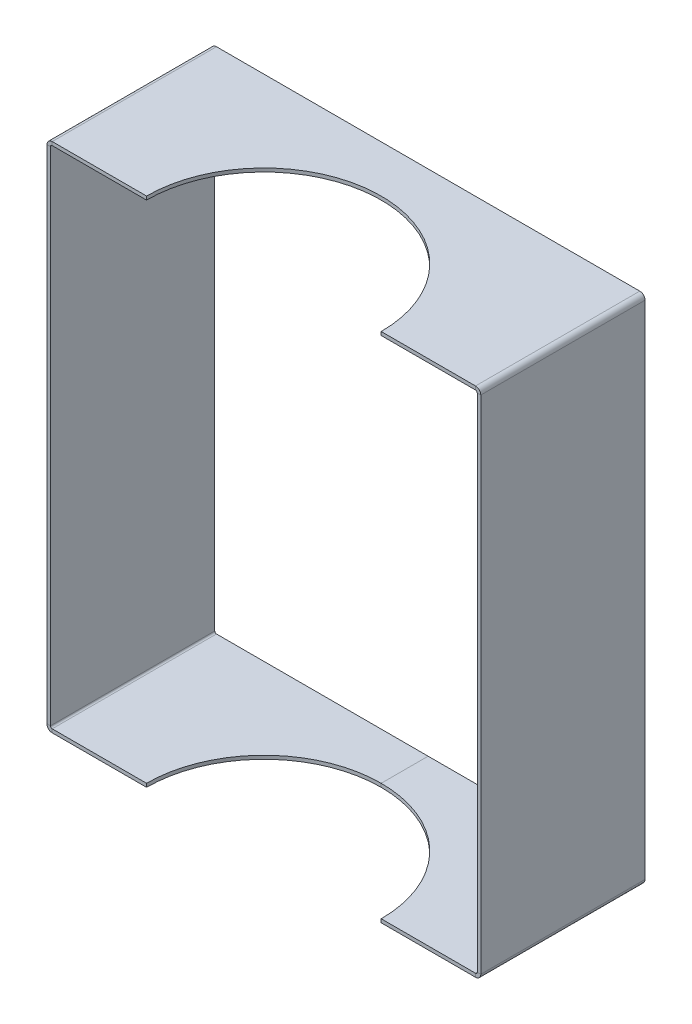
ISO-10303-21;
HEADER;
FILE_DESCRIPTION(('STEP AP214'),'2;1');
FILE_NAME('part.step','',(''),(''),'','','');
FILE_SCHEMA(('AUTOMOTIVE_DESIGN { 1 0 10303 214 1 1 1 1 }'));
ENDSEC;
DATA;
#1=APPLICATION_CONTEXT('core data for automotive mechanical design processes');
#2=APPLICATION_PROTOCOL_DEFINITION('international standard','automotive_design',2000,#1);
#3=PRODUCT_CONTEXT('',#1,'mechanical');
#4=PRODUCT('Part','Part','',(#3));
#5=PRODUCT_RELATED_PRODUCT_CATEGORY('part','',(#4));
#6=PRODUCT_DEFINITION_FORMATION('','',#4);
#7=PRODUCT_DEFINITION_CONTEXT('part definition',#1,'design');
#8=PRODUCT_DEFINITION('design','',#6,#7);
#9=PRODUCT_DEFINITION_SHAPE('','',#8);
#10=(LENGTH_UNIT() NAMED_UNIT(*) SI_UNIT(.MILLI.,.METRE.));
#11=(NAMED_UNIT(*) PLANE_ANGLE_UNIT() SI_UNIT($,.RADIAN.));
#12=(NAMED_UNIT(*) SI_UNIT($,.STERADIAN.) SOLID_ANGLE_UNIT());
#13=UNCERTAINTY_MEASURE_WITH_UNIT(LENGTH_MEASURE(1.E-05),#10,'distance_accuracy_value','');
#14=(GEOMETRIC_REPRESENTATION_CONTEXT(3) GLOBAL_UNCERTAINTY_ASSIGNED_CONTEXT((#13)) GLOBAL_UNIT_ASSIGNED_CONTEXT((#10,
#11,#12)) REPRESENTATION_CONTEXT('',''));
#15=CARTESIAN_POINT('',(0.,0.,0.));
#16=DIRECTION('',(0.,0.,1.));
#17=DIRECTION('',(1.,0.,0.));
#18=AXIS2_PLACEMENT_3D('',#15,#16,#17);
#19=CARTESIAN_POINT('',(-90.2234000000008,1.5,173.673110700389));
#20=DIRECTION('',(0.,0.,-1.));
#21=DIRECTION('',(-1.,0.,0.));
#22=AXIS2_PLACEMENT_3D('',#19,#20,#21);
#23=PLANE('',#22);
#24=DIRECTION('',(1.,0.,0.));
#25=VECTOR('',#24,1.);
#26=CARTESIAN_POINT('',(-90.2234000000008,0.,173.673110700389));
#27=LINE('',#26,#25);
#28=CARTESIAN_POINT('',(-90.2234000000008,0.,173.673110700389));
#29=VERTEX_POINT('',#28);
#30=CARTESIAN_POINT('',(-50.0234000000008,0.,173.673110700389));
#31=VERTEX_POINT('',#30);
#32=EDGE_CURVE('E151',#29,#31,#27,.T.);
#33=ORIENTED_EDGE('',*,*,#32,.T.);
#34=DIRECTION('',(0.,-1.,0.));
#35=VECTOR('',#34,1.);
#36=CARTESIAN_POINT('',(-50.0234000000008,1.5,173.673110700389));
#37=LINE('',#36,#35);
#38=CARTESIAN_POINT('',(-50.0234000000008,1.5,173.673110700389));
#39=VERTEX_POINT('',#38);
#40=EDGE_CURVE('E131',#39,#31,#37,.T.);
#41=ORIENTED_EDGE('',*,*,#40,.F.);
#42=DIRECTION('',(1.,0.,0.));
#43=VECTOR('',#42,1.);
#44=CARTESIAN_POINT('',(-90.2234000000008,1.5,173.673110700389));
#45=LINE('',#44,#43);
#46=CARTESIAN_POINT('',(-90.2234000000008,1.5,173.673110700389));
#47=VERTEX_POINT('',#46);
#48=EDGE_CURVE('E182',#47,#39,#45,.T.);
#49=ORIENTED_EDGE('',*,*,#48,.F.);
#50=DIRECTION('',(0.,-1.,0.));
#51=VECTOR('',#50,1.);
#52=CARTESIAN_POINT('',(-90.2234000000008,1.5,173.673110700389));
#53=LINE('',#52,#51);
#54=EDGE_CURVE('E13',#47,#29,#53,.T.);
#55=ORIENTED_EDGE('',*,*,#54,.T.);
#56=EDGE_LOOP('',(#33,#41,#49,#55));
#57=FACE_BOUND('',#56,.T.);
#58=ADVANCED_FACE('F123',(#57),#23,.F.);
#59=CARTESIAN_POINT('',(-0.0234000000007839,1.5,173.673110700389));
#60=DIRECTION('',(0.,-1.,0.));
#61=DIRECTION('',(0.,0.,-1.));
#62=AXIS2_PLACEMENT_3D('',#59,#60,#61);
#63=CYLINDRICAL_SURFACE('',#62,50.);
#64=CARTESIAN_POINT('',(-0.0234000000007839,0.,173.673110700389));
#65=DIRECTION('',(0.,-1.,0.));
#66=DIRECTION('',(0.,0.,-1.));
#67=AXIS2_PLACEMENT_3D('',#64,#65,#66);
#68=CIRCLE('',#67,50.);
#69=CARTESIAN_POINT('',(49.9765999999992,0.,173.673110700389));
#70=VERTEX_POINT('',#69);
#71=EDGE_CURVE('E211',#31,#70,#68,.T.);
#72=ORIENTED_EDGE('',*,*,#71,.T.);
#73=DIRECTION('',(0.,-1.,0.));
#74=VECTOR('',#73,1.);
#75=CARTESIAN_POINT('',(49.9765999999992,1.5,173.673110700389));
#76=LINE('',#75,#74);
#77=CARTESIAN_POINT('',(49.9765999999992,1.5,173.673110700389));
#78=VERTEX_POINT('',#77);
#79=EDGE_CURVE('E194',#78,#70,#76,.T.);
#80=ORIENTED_EDGE('',*,*,#79,.F.);
#81=CARTESIAN_POINT('',(-0.0234000000007839,1.5,173.673110700389));
#82=DIRECTION('',(0.,-1.,0.));
#83=DIRECTION('',(0.,0.,-1.));
#84=AXIS2_PLACEMENT_3D('',#81,#82,#83);
#85=CIRCLE('',#84,50.);
#86=EDGE_CURVE('E186',#39,#78,#85,.T.);
#87=ORIENTED_EDGE('',*,*,#86,.F.);
#88=ORIENTED_EDGE('',*,*,#40,.T.);
#89=EDGE_LOOP('',(#72,#80,#87,#88));
#90=FACE_BOUND('',#89,.T.);
#91=ADVANCED_FACE('F195',(#90),#63,.F.);
#92=CARTESIAN_POINT('',(49.9765999999992,1.5,173.673110700389));
#93=DIRECTION('',(0.,0.,-1.));
#94=DIRECTION('',(-1.,0.,0.));
#95=AXIS2_PLACEMENT_3D('',#92,#93,#94);
#96=PLANE('',#95);
#97=DIRECTION('',(1.,0.,0.));
#98=VECTOR('',#97,1.);
#99=CARTESIAN_POINT('',(49.9765999999992,0.,173.673110700389));
#100=LINE('',#99,#98);
#101=CARTESIAN_POINT('',(90.1765999999992,0.,173.673110700389));
#102=VERTEX_POINT('',#101);
#103=EDGE_CURVE('E213',#70,#102,#100,.T.);
#104=ORIENTED_EDGE('',*,*,#103,.T.);
#105=DIRECTION('',(0.,-1.,0.));
#106=VECTOR('',#105,1.);
#107=CARTESIAN_POINT('',(90.1765999999992,1.5,173.673110700389));
#108=LINE('',#107,#106);
#109=CARTESIAN_POINT('',(90.1765999999993,1.5,173.673110700389));
#110=VERTEX_POINT('',#109);
#111=EDGE_CURVE('E226',#110,#102,#108,.T.);
#112=ORIENTED_EDGE('',*,*,#111,.F.);
#113=DIRECTION('',(1.,0.,0.));
#114=VECTOR('',#113,1.);
#115=CARTESIAN_POINT('',(49.9765999999992,1.5,173.673110700389));
#116=LINE('',#115,#114);
#117=EDGE_CURVE('E198',#78,#110,#116,.T.);
#118=ORIENTED_EDGE('',*,*,#117,.F.);
#119=ORIENTED_EDGE('',*,*,#79,.T.);
#120=EDGE_LOOP('',(#104,#112,#118,#119));
#121=FACE_BOUND('',#120,.T.);
#122=ADVANCED_FACE('F230',(#121),#96,.F.);
#123=CARTESIAN_POINT('',(-90.2234000000008,1.5,103.673110700389));
#124=DIRECTION('',(0.,0.,1.));
#125=DIRECTION('',(1.,0.,0.));
#126=AXIS2_PLACEMENT_3D('',#123,#124,#125);
#127=PLANE('',#126);
#128=DIRECTION('',(-1.,0.,0.));
#129=VECTOR('',#128,1.);
#130=CARTESIAN_POINT('',(-90.2234000000008,0.,103.673110700389));
#131=LINE('',#130,#129);
#132=CARTESIAN_POINT('',(90.1765999999992,0.,103.673110700389));
#133=VERTEX_POINT('',#132);
#134=CARTESIAN_POINT('',(-90.2234000000008,0.,103.673110700389));
#135=VERTEX_POINT('',#134);
#136=EDGE_CURVE('E218',#133,#135,#131,.T.);
#137=ORIENTED_EDGE('',*,*,#136,.T.);
#138=DIRECTION('',(0.,-1.,0.));
#139=VECTOR('',#138,1.);
#140=CARTESIAN_POINT('',(-90.2234000000008,1.5,103.673110700389));
#141=LINE('',#140,#139);
#142=CARTESIAN_POINT('',(-90.2234000000008,1.49999999999998,103.673110700389));
#143=VERTEX_POINT('',#142);
#144=EDGE_CURVE('E206',#143,#135,#141,.T.);
#145=ORIENTED_EDGE('',*,*,#144,.F.);
#146=DIRECTION('',(-1.,0.,0.));
#147=VECTOR('',#146,1.);
#148=CARTESIAN_POINT('',(-90.2234000000008,1.5,103.673110700389));
#149=LINE('',#148,#147);
#150=CARTESIAN_POINT('',(90.1765999999992,1.5,103.673110700389));
#151=VERTEX_POINT('',#150);
#152=EDGE_CURVE('E204',#151,#143,#149,.T.);
#153=ORIENTED_EDGE('',*,*,#152,.F.);
#154=DIRECTION('',(0.,-1.,0.));
#155=VECTOR('',#154,1.);
#156=CARTESIAN_POINT('',(90.1765999999992,1.5,103.673110700389));
#157=LINE('',#156,#155);
#158=EDGE_CURVE('E223',#151,#133,#157,.T.);
#159=ORIENTED_EDGE('',*,*,#158,.T.);
#160=EDGE_LOOP('',(#137,#145,#153,#159));
#161=FACE_BOUND('',#160,.T.);
#162=ADVANCED_FACE('F254',(#161),#127,.F.);
#163=CARTESIAN_POINT('',(-0.0234000000007839,1.5,173.673110700389));
#164=DIRECTION('',(0.,-1.,0.));
#165=DIRECTION('',(0.,0.,-1.));
#166=AXIS2_PLACEMENT_3D('',#163,#164,#165);
#167=PLANE('',#166);
#168=DIRECTION('',(0.,0.,1.));
#169=VECTOR('',#168,1.);
#170=CARTESIAN_POINT('',(-90.2234000000008,1.5,103.673110700389));
#171=LINE('',#170,#169);
#172=EDGE_CURVE('E190',#143,#47,#171,.T.);
#173=ORIENTED_EDGE('',*,*,#172,.T.);
#174=ORIENTED_EDGE('',*,*,#48,.T.);
#175=ORIENTED_EDGE('',*,*,#86,.T.);
#176=ORIENTED_EDGE('',*,*,#117,.T.);
#177=DIRECTION('',(0.,0.,-1.));
#178=VECTOR('',#177,1.);
#179=CARTESIAN_POINT('',(90.1765999999992,1.5,103.673110700389));
#180=LINE('',#179,#178);
#181=EDGE_CURVE('E159',#110,#151,#180,.T.);
#182=ORIENTED_EDGE('',*,*,#181,.T.);
#183=ORIENTED_EDGE('',*,*,#152,.T.);
#184=EDGE_LOOP('',(#173,#174,#175,#176,#182,#183));
#185=FACE_BOUND('',#184,.T.);
#186=ADVANCED_FACE('F183',(#185),#167,.F.);
#187=CARTESIAN_POINT('',(-0.0234000000007839,0.,173.673110700389));
#188=DIRECTION('',(0.,-1.,0.));
#189=DIRECTION('',(0.,0.,-1.));
#190=AXIS2_PLACEMENT_3D('',#187,#188,#189);
#191=PLANE('',#190);
#192=DIRECTION('',(0.,0.,1.));
#193=VECTOR('',#192,1.);
#194=CARTESIAN_POINT('',(-90.2234000000008,0.,103.673110700389));
#195=LINE('',#194,#193);
#196=EDGE_CURVE('E207',#135,#29,#195,.T.);
#197=ORIENTED_EDGE('',*,*,#196,.F.);
#198=ORIENTED_EDGE('',*,*,#136,.F.);
#199=DIRECTION('',(0.,0.,-1.));
#200=VECTOR('',#199,1.);
#201=CARTESIAN_POINT('',(90.1765999999992,0.,103.673110700389));
#202=LINE('',#201,#200);
#203=EDGE_CURVE('E216',#102,#133,#202,.T.);
#204=ORIENTED_EDGE('',*,*,#203,.F.);
#205=ORIENTED_EDGE('',*,*,#103,.F.);
#206=ORIENTED_EDGE('',*,*,#71,.F.);
#207=ORIENTED_EDGE('',*,*,#32,.F.);
#208=EDGE_LOOP('',(#197,#198,#204,#205,#206,#207));
#209=FACE_BOUND('',#208,.T.);
#210=ADVANCED_FACE('F235',(#209),#191,.T.);
#211=CARTESIAN_POINT('',(90.1765999999992,-0.736600000000006,103.673110700389));
#212=DIRECTION('',(0.,0.,-1.));
#213=DIRECTION('',(-1.,0.,0.));
#214=AXIS2_PLACEMENT_3D('',#211,#212,#213);
#215=PLANE('',#214);
#216=DIRECTION('',(1.,0.,0.));
#217=VECTOR('',#216,1.);
#218=CARTESIAN_POINT('',(92.4131999999992,-0.736600000000004,103.673110700389));
#219=LINE('',#218,#217);
#220=CARTESIAN_POINT('',(90.9131999999992,-0.736600000000004,103.673110700389));
#221=VERTEX_POINT('',#220);
#222=CARTESIAN_POINT('',(92.4131999999992,-0.736599999999999,103.673110700389));
#223=VERTEX_POINT('',#222);
#224=EDGE_CURVE('E249',#221,#223,#219,.T.);
#225=ORIENTED_EDGE('',*,*,#224,.F.);
#226=CARTESIAN_POINT('',(90.1765999999992,-0.736600000000006,103.673110700389));
#227=DIRECTION('',(0.,0.,1.));
#228=DIRECTION('',(1.,0.,0.));
#229=AXIS2_PLACEMENT_3D('',#226,#227,#228);
#230=CIRCLE('',#229,0.736600000000004);
#231=EDGE_CURVE('E242',#133,#221,#230,.F.);
#232=ORIENTED_EDGE('',*,*,#231,.F.);
#233=ORIENTED_EDGE('',*,*,#158,.F.);
#234=CARTESIAN_POINT('',(90.1765999999992,-0.736600000000006,103.673110700389));
#235=DIRECTION('',(0.,0.,1.));
#236=DIRECTION('',(1.,0.,0.));
#237=AXIS2_PLACEMENT_3D('',#234,#235,#236);
#238=CIRCLE('',#237,2.2366);
#239=EDGE_CURVE('E139',#151,#223,#238,.F.);
#240=ORIENTED_EDGE('',*,*,#239,.T.);
#241=EDGE_LOOP('',(#225,#232,#233,#240));
#242=FACE_BOUND('',#241,.T.);
#243=ADVANCED_FACE('F247',(#242),#215,.T.);
#244=CARTESIAN_POINT('',(90.1765999999992,-0.736600000000006,173.673110700389));
#245=DIRECTION('',(0.,0.,-1.));
#246=DIRECTION('',(-1.,0.,0.));
#247=AXIS2_PLACEMENT_3D('',#244,#245,#246);
#248=PLANE('',#247);
#249=CARTESIAN_POINT('',(90.1765999999992,-0.736600000000006,173.673110700389));
#250=DIRECTION('',(0.,0.,1.));
#251=DIRECTION('',(1.,0.,0.));
#252=AXIS2_PLACEMENT_3D('',#249,#250,#251);
#253=CIRCLE('',#252,0.736600000000004);
#254=CARTESIAN_POINT('',(90.9131999999992,-0.736600000000004,173.673110700389));
#255=VERTEX_POINT('',#254);
#256=EDGE_CURVE('E245',#255,#102,#253,.T.);
#257=ORIENTED_EDGE('',*,*,#256,.F.);
#258=DIRECTION('',(1.,0.,0.));
#259=VECTOR('',#258,1.);
#260=CARTESIAN_POINT('',(90.9131999999992,-0.736600000000004,173.673110700389));
#261=LINE('',#260,#259);
#262=CARTESIAN_POINT('',(92.4131999999992,-0.736599999999999,173.673110700389));
#263=VERTEX_POINT('',#262);
#264=EDGE_CURVE('E377',#255,#263,#261,.T.);
#265=ORIENTED_EDGE('',*,*,#264,.T.);
#266=CARTESIAN_POINT('',(90.1765999999992,-0.736600000000006,173.673110700389));
#267=DIRECTION('',(0.,0.,1.));
#268=DIRECTION('',(1.,0.,0.));
#269=AXIS2_PLACEMENT_3D('',#266,#267,#268);
#270=CIRCLE('',#269,2.2366);
#271=EDGE_CURVE('E250',#263,#110,#270,.T.);
#272=ORIENTED_EDGE('',*,*,#271,.T.);
#273=ORIENTED_EDGE('',*,*,#111,.T.);
#274=EDGE_LOOP('',(#257,#265,#272,#273));
#275=FACE_BOUND('',#274,.T.);
#276=ADVANCED_FACE('F385',(#275),#248,.F.);
#277=CARTESIAN_POINT('',(90.1765999999992,-0.736600000000006,173.673110700389));
#278=DIRECTION('',(0.,0.,1.));
#279=DIRECTION('',(1.,0.,0.));
#280=AXIS2_PLACEMENT_3D('',#277,#278,#279);
#281=CYLINDRICAL_SURFACE('',#280,2.2366);
#282=ORIENTED_EDGE('',*,*,#181,.F.);
#283=ORIENTED_EDGE('',*,*,#271,.F.);
#284=DIRECTION('',(0.,0.,1.));
#285=VECTOR('',#284,1.);
#286=CARTESIAN_POINT('',(92.4131999999992,-0.736599999999999,173.673110700389));
#287=LINE('',#286,#285);
#288=EDGE_CURVE('E329',#223,#263,#287,.T.);
#289=ORIENTED_EDGE('',*,*,#288,.F.);
#290=ORIENTED_EDGE('',*,*,#239,.F.);
#291=EDGE_LOOP('',(#282,#283,#289,#290));
#292=FACE_BOUND('',#291,.T.);
#293=ADVANCED_FACE('F387',(#292),#281,.T.);
#294=CARTESIAN_POINT('',(90.1765999999992,-0.736600000000006,173.673110700389));
#295=DIRECTION('',(0.,0.,1.));
#296=DIRECTION('',(1.,0.,0.));
#297=AXIS2_PLACEMENT_3D('',#294,#295,#296);
#298=CYLINDRICAL_SURFACE('',#297,0.736600000000004);
#299=ORIENTED_EDGE('',*,*,#203,.T.);
#300=ORIENTED_EDGE('',*,*,#231,.T.);
#301=DIRECTION('',(0.,0.,-1.));
#302=VECTOR('',#301,1.);
#303=CARTESIAN_POINT('',(90.9131999999992,-0.736600000000004,103.673110700389));
#304=LINE('',#303,#302);
#305=EDGE_CURVE('E327',#221,#255,#304,.F.);
#306=ORIENTED_EDGE('',*,*,#305,.T.);
#307=ORIENTED_EDGE('',*,*,#256,.T.);
#308=EDGE_LOOP('',(#299,#300,#306,#307));
#309=FACE_BOUND('',#308,.T.);
#310=ADVANCED_FACE('F241',(#309),#298,.F.);
#311=CARTESIAN_POINT('',(92.4131999999992,0.,173.673110700389));
#312=DIRECTION('',(0.,0.,1.));
#313=DIRECTION('',(1.,0.,0.));
#314=AXIS2_PLACEMENT_3D('',#311,#312,#313);
#315=PLANE('',#314);
#316=DIRECTION('',(0.,1.,0.));
#317=VECTOR('',#316,1.);
#318=CARTESIAN_POINT('',(92.4131999999992,0.,173.673110700389));
#319=LINE('',#318,#317);
#320=CARTESIAN_POINT('',(92.4132,-214.5,173.673110700389));
#321=VERTEX_POINT('',#320);
#322=EDGE_CURVE('E342',#321,#263,#319,.T.);
#323=ORIENTED_EDGE('',*,*,#322,.T.);
#324=ORIENTED_EDGE('',*,*,#264,.F.);
#325=DIRECTION('',(0.,-1.,0.));
#326=VECTOR('',#325,1.);
#327=CARTESIAN_POINT('',(90.9131999999992,0.,173.673110700389));
#328=LINE('',#327,#326);
#329=CARTESIAN_POINT('',(90.9132,-214.5,173.673110700389));
#330=VERTEX_POINT('',#329);
#331=EDGE_CURVE('E352',#330,#255,#328,.F.);
#332=ORIENTED_EDGE('',*,*,#331,.F.);
#333=DIRECTION('',(-1.,0.,0.));
#334=VECTOR('',#333,1.);
#335=CARTESIAN_POINT('',(92.4132,-214.5,173.673110700389));
#336=LINE('',#335,#334);
#337=EDGE_CURVE('E341',#321,#330,#336,.T.);
#338=ORIENTED_EDGE('',*,*,#337,.F.);
#339=EDGE_LOOP('',(#323,#324,#332,#338));
#340=FACE_BOUND('',#339,.T.);
#341=ADVANCED_FACE('F660',(#340),#315,.T.);
#342=CARTESIAN_POINT('',(92.4132,-214.5,103.673110700389));
#343=DIRECTION('',(0.,0.,-1.));
#344=DIRECTION('',(-1.,0.,0.));
#345=AXIS2_PLACEMENT_3D('',#342,#343,#344);
#346=PLANE('',#345);
#347=DIRECTION('',(0.,1.,0.));
#348=VECTOR('',#347,1.);
#349=CARTESIAN_POINT('',(90.9131999999992,0.,103.673110700389));
#350=LINE('',#349,#348);
#351=CARTESIAN_POINT('',(90.9132,-214.5,103.673110700389));
#352=VERTEX_POINT('',#351);
#353=EDGE_CURVE('E320',#221,#352,#350,.F.);
#354=ORIENTED_EDGE('',*,*,#353,.F.);
#355=ORIENTED_EDGE('',*,*,#224,.T.);
#356=DIRECTION('',(0.,-1.,0.));
#357=VECTOR('',#356,1.);
#358=CARTESIAN_POINT('',(92.4132,-214.5,103.673110700389));
#359=LINE('',#358,#357);
#360=CARTESIAN_POINT('',(92.4132,-214.5,103.673110700389));
#361=VERTEX_POINT('',#360);
#362=EDGE_CURVE('E335',#223,#361,#359,.T.);
#363=ORIENTED_EDGE('',*,*,#362,.T.);
#364=DIRECTION('',(-1.,0.,0.));
#365=VECTOR('',#364,1.);
#366=CARTESIAN_POINT('',(92.4132,-214.5,103.673110700389));
#367=LINE('',#366,#365);
#368=EDGE_CURVE('E332',#361,#352,#367,.T.);
#369=ORIENTED_EDGE('',*,*,#368,.T.);
#370=EDGE_LOOP('',(#354,#355,#363,#369));
#371=FACE_BOUND('',#370,.T.);
#372=ADVANCED_FACE('F333',(#371),#346,.T.);
#373=CARTESIAN_POINT('',(92.4131999999992,0.,173.673110700389));
#374=DIRECTION('',(1.,0.,0.));
#375=DIRECTION('',(0.,1.,0.));
#376=AXIS2_PLACEMENT_3D('',#373,#374,#375);
#377=PLANE('',#376);
#378=ORIENTED_EDGE('',*,*,#362,.F.);
#379=ORIENTED_EDGE('',*,*,#288,.T.);
#380=ORIENTED_EDGE('',*,*,#322,.F.);
#381=DIRECTION('',(0.,0.,1.));
#382=VECTOR('',#381,1.);
#383=CARTESIAN_POINT('',(92.4132,-214.5,173.673110700389));
#384=LINE('',#383,#382);
#385=EDGE_CURVE('E370',#361,#321,#384,.T.);
#386=ORIENTED_EDGE('',*,*,#385,.F.);
#387=EDGE_LOOP('',(#378,#379,#380,#386));
#388=FACE_BOUND('',#387,.T.);
#389=ADVANCED_FACE('F389',(#388),#377,.T.);
#390=CARTESIAN_POINT('',(90.9131999999992,0.,173.673110700389));
#391=DIRECTION('',(1.,0.,0.));
#392=DIRECTION('',(0.,1.,0.));
#393=AXIS2_PLACEMENT_3D('',#390,#391,#392);
#394=PLANE('',#393);
#395=ORIENTED_EDGE('',*,*,#305,.F.);
#396=ORIENTED_EDGE('',*,*,#353,.T.);
#397=DIRECTION('',(0.,0.,-1.));
#398=VECTOR('',#397,1.);
#399=CARTESIAN_POINT('',(90.9132,-214.5,173.673110700389));
#400=LINE('',#399,#398);
#401=EDGE_CURVE('E325',#352,#330,#400,.F.);
#402=ORIENTED_EDGE('',*,*,#401,.T.);
#403=ORIENTED_EDGE('',*,*,#331,.T.);
#404=EDGE_LOOP('',(#395,#396,#402,#403));
#405=FACE_BOUND('',#404,.T.);
#406=ADVANCED_FACE('F322',(#405),#394,.F.);
#407=CARTESIAN_POINT('',(90.1766,-214.5,103.673110700389));
#408=DIRECTION('',(0.,0.,-1.));
#409=DIRECTION('',(-1.,0.,0.));
#410=AXIS2_PLACEMENT_3D('',#407,#408,#409);
#411=PLANE('',#410);
#412=DIRECTION('',(0.,-1.,0.));
#413=VECTOR('',#412,1.);
#414=CARTESIAN_POINT('',(90.1766,-216.7366,103.673110700389));
#415=LINE('',#414,#413);
#416=CARTESIAN_POINT('',(90.1766,-215.2366,103.673110700389));
#417=VERTEX_POINT('',#416);
#418=CARTESIAN_POINT('',(90.1766,-216.7366,103.673110700389));
#419=VERTEX_POINT('',#418);
#420=EDGE_CURVE('E356',#417,#419,#415,.T.);
#421=ORIENTED_EDGE('',*,*,#420,.F.);
#422=CARTESIAN_POINT('',(90.1766,-214.5,103.673110700389));
#423=DIRECTION('',(0.,0.,1.));
#424=DIRECTION('',(1.,0.,0.));
#425=AXIS2_PLACEMENT_3D('',#422,#423,#424);
#426=CIRCLE('',#425,0.736600000000004);
#427=EDGE_CURVE('E348',#352,#417,#426,.F.);
#428=ORIENTED_EDGE('',*,*,#427,.F.);
#429=ORIENTED_EDGE('',*,*,#368,.F.);
#430=CARTESIAN_POINT('',(90.1766,-214.5,103.673110700389));
#431=DIRECTION('',(0.,0.,1.));
#432=DIRECTION('',(1.,0.,0.));
#433=AXIS2_PLACEMENT_3D('',#430,#431,#432);
#434=CIRCLE('',#433,2.2366);
#435=EDGE_CURVE('E360',#361,#419,#434,.F.);
#436=ORIENTED_EDGE('',*,*,#435,.T.);
#437=EDGE_LOOP('',(#421,#428,#429,#436));
#438=FACE_BOUND('',#437,.T.);
#439=ADVANCED_FACE('F354',(#438),#411,.T.);
#440=CARTESIAN_POINT('',(90.1766,-214.5,173.673110700389));
#441=DIRECTION('',(0.,0.,-1.));
#442=DIRECTION('',(-1.,0.,0.));
#443=AXIS2_PLACEMENT_3D('',#440,#441,#442);
#444=PLANE('',#443);
#445=CARTESIAN_POINT('',(90.1766,-214.5,173.673110700389));
#446=DIRECTION('',(0.,0.,1.));
#447=DIRECTION('',(1.,0.,0.));
#448=AXIS2_PLACEMENT_3D('',#445,#446,#447);
#449=CIRCLE('',#448,0.736600000000004);
#450=CARTESIAN_POINT('',(90.1766,-215.2366,173.673110700389));
#451=VERTEX_POINT('',#450);
#452=EDGE_CURVE('E351',#451,#330,#449,.T.);
#453=ORIENTED_EDGE('',*,*,#452,.F.);
#454=DIRECTION('',(0.,-1.,0.));
#455=VECTOR('',#454,1.);
#456=CARTESIAN_POINT('',(90.1766,-215.2366,173.673110700389));
#457=LINE('',#456,#455);
#458=CARTESIAN_POINT('',(90.1766,-216.7366,173.673110700389));
#459=VERTEX_POINT('',#458);
#460=EDGE_CURVE('E397',#451,#459,#457,.T.);
#461=ORIENTED_EDGE('',*,*,#460,.T.);
#462=CARTESIAN_POINT('',(90.1766,-214.5,173.673110700389));
#463=DIRECTION('',(0.,0.,1.));
#464=DIRECTION('',(1.,0.,0.));
#465=AXIS2_PLACEMENT_3D('',#462,#463,#464);
#466=CIRCLE('',#465,2.2366);
#467=EDGE_CURVE('E357',#459,#321,#466,.T.);
#468=ORIENTED_EDGE('',*,*,#467,.T.);
#469=ORIENTED_EDGE('',*,*,#337,.T.);
#470=EDGE_LOOP('',(#453,#461,#468,#469));
#471=FACE_BOUND('',#470,.T.);
#472=ADVANCED_FACE('F395',(#471),#444,.F.);
#473=CARTESIAN_POINT('',(90.1766,-214.5,173.673110700389));
#474=DIRECTION('',(0.,0.,1.));
#475=DIRECTION('',(0.,-1.,0.));
#476=AXIS2_PLACEMENT_3D('',#473,#474,#475);
#477=CYLINDRICAL_SURFACE('',#476,2.2366);
#478=ORIENTED_EDGE('',*,*,#385,.T.);
#479=ORIENTED_EDGE('',*,*,#467,.F.);
#480=DIRECTION('',(0.,0.,1.));
#481=VECTOR('',#480,1.);
#482=CARTESIAN_POINT('',(90.1766,-216.7366,103.673110700389));
#483=LINE('',#482,#481);
#484=EDGE_CURVE('E403',#459,#419,#483,.F.);
#485=ORIENTED_EDGE('',*,*,#484,.T.);
#486=ORIENTED_EDGE('',*,*,#435,.F.);
#487=EDGE_LOOP('',(#478,#479,#485,#486));
#488=FACE_BOUND('',#487,.T.);
#489=ADVANCED_FACE('F392',(#488),#477,.T.);
#490=CARTESIAN_POINT('',(90.1766,-214.5,173.673110700389));
#491=DIRECTION('',(0.,0.,1.));
#492=DIRECTION('',(0.,-1.,0.));
#493=AXIS2_PLACEMENT_3D('',#490,#491,#492);
#494=CYLINDRICAL_SURFACE('',#493,0.736600000000004);
#495=ORIENTED_EDGE('',*,*,#401,.F.);
#496=ORIENTED_EDGE('',*,*,#427,.T.);
#497=DIRECTION('',(0.,0.,1.));
#498=VECTOR('',#497,1.);
#499=CARTESIAN_POINT('',(90.1766,-215.2366,103.673110700389));
#500=LINE('',#499,#498);
#501=EDGE_CURVE('E404',#417,#451,#500,.T.);
#502=ORIENTED_EDGE('',*,*,#501,.T.);
#503=ORIENTED_EDGE('',*,*,#452,.T.);
#504=EDGE_LOOP('',(#495,#496,#502,#503));
#505=FACE_BOUND('',#504,.T.);
#506=ADVANCED_FACE('F347',(#505),#494,.F.);
#507=CARTESIAN_POINT('',(49.9766000000007,-216.7366,173.673110700388));
#508=DIRECTION('',(0.,0.,1.));
#509=DIRECTION('',(1.,0.,0.));
#510=AXIS2_PLACEMENT_3D('',#507,#508,#509);
#511=PLANE('',#510);
#512=DIRECTION('',(-1.,0.,0.));
#513=VECTOR('',#512,1.);
#514=CARTESIAN_POINT('',(49.9766000000007,-216.7366,173.673110700388));
#515=LINE('',#514,#513);
#516=CARTESIAN_POINT('',(49.9766000000007,-216.7366,173.673110700388));
#517=VERTEX_POINT('',#516);
#518=EDGE_CURVE('E411',#517,#459,#515,.F.);
#519=ORIENTED_EDGE('',*,*,#518,.T.);
#520=ORIENTED_EDGE('',*,*,#460,.F.);
#521=DIRECTION('',(1.,0.,0.));
#522=VECTOR('',#521,1.);
#523=CARTESIAN_POINT('',(-0.0218000000000137,-215.236600000001,173.673110700388));
#524=LINE('',#523,#522);
#525=CARTESIAN_POINT('',(49.9766000000007,-215.2366,173.673110700388));
#526=VERTEX_POINT('',#525);
#527=EDGE_CURVE('E431',#526,#451,#524,.T.);
#528=ORIENTED_EDGE('',*,*,#527,.F.);
#529=DIRECTION('',(0.,1.,0.));
#530=VECTOR('',#529,1.);
#531=CARTESIAN_POINT('',(49.9766000000007,-216.7366,173.673110700388));
#532=LINE('',#531,#530);
#533=EDGE_CURVE('E362',#517,#526,#532,.T.);
#534=ORIENTED_EDGE('',*,*,#533,.F.);
#535=EDGE_LOOP('',(#519,#520,#528,#534));
#536=FACE_BOUND('',#535,.T.);
#537=ADVANCED_FACE('F416',(#536),#511,.T.);
#538=CARTESIAN_POINT('',(-0.0218000000000171,-216.736600000001,103.673110700389));
#539=DIRECTION('',(0.,0.,-1.));
#540=DIRECTION('',(-1.,0.,0.));
#541=AXIS2_PLACEMENT_3D('',#538,#539,#540);
#542=PLANE('',#541);
#543=DIRECTION('',(-1.,0.,0.));
#544=VECTOR('',#543,1.);
#545=CARTESIAN_POINT('',(-0.021800000000035,-215.236600000001,103.673110700389));
#546=LINE('',#545,#544);
#547=CARTESIAN_POINT('',(-0.0218000000000276,-215.236600000001,103.673110700389));
#548=VERTEX_POINT('',#547);
#549=EDGE_CURVE('E414',#417,#548,#546,.T.);
#550=ORIENTED_EDGE('',*,*,#549,.F.);
#551=ORIENTED_EDGE('',*,*,#420,.T.);
#552=DIRECTION('',(1.,0.,0.));
#553=VECTOR('',#552,1.);
#554=CARTESIAN_POINT('',(-0.0218000000000171,-216.736600000001,103.673110700389));
#555=LINE('',#554,#553);
#556=CARTESIAN_POINT('',(-0.0218000000000171,-216.736600000001,103.673110700389));
#557=VERTEX_POINT('',#556);
#558=EDGE_CURVE('E413',#419,#557,#555,.F.);
#559=ORIENTED_EDGE('',*,*,#558,.T.);
#560=DIRECTION('',(0.,1.,0.));
#561=VECTOR('',#560,1.);
#562=CARTESIAN_POINT('',(-0.0218000000000171,-216.736600000001,103.673110700389));
#563=LINE('',#562,#561);
#564=EDGE_CURVE('E418',#557,#548,#563,.T.);
#565=ORIENTED_EDGE('',*,*,#564,.T.);
#566=EDGE_LOOP('',(#550,#551,#559,#565));
#567=FACE_BOUND('',#566,.T.);
#568=ADVANCED_FACE('F444',(#567),#542,.T.);
#569=CARTESIAN_POINT('',(-0.0218000000000032,-216.736600000001,173.673110700389));
#570=DIRECTION('',(0.,1.,0.));
#571=DIRECTION('',(-1.,0.,0.));
#572=AXIS2_PLACEMENT_3D('',#569,#570,#571);
#573=PLANE('',#572);
#574=ORIENTED_EDGE('',*,*,#484,.F.);
#575=ORIENTED_EDGE('',*,*,#518,.F.);
#576=CARTESIAN_POINT('',(-0.0218000000000032,-216.736600000001,173.673110700389));
#577=DIRECTION('',(0.,1.,0.));
#578=DIRECTION('',(-1.,0.,0.));
#579=AXIS2_PLACEMENT_3D('',#576,#577,#578);
#580=CIRCLE('',#579,49.9984000000007);
#581=CARTESIAN_POINT('',(-0.0218000000000032,-216.736600000001,123.674710700388));
#582=VERTEX_POINT('',#581);
#583=EDGE_CURVE('E419',#582,#517,#580,.F.);
#584=ORIENTED_EDGE('',*,*,#583,.F.);
#585=DIRECTION('',(0.,0.,-1.));
#586=VECTOR('',#585,1.);
#587=CARTESIAN_POINT('',(-0.0218000000000032,-216.736600000001,123.674710700388));
#588=LINE('',#587,#586);
#589=EDGE_CURVE('E424',#557,#582,#588,.F.);
#590=ORIENTED_EDGE('',*,*,#589,.F.);
#591=ORIENTED_EDGE('',*,*,#558,.F.);
#592=EDGE_LOOP('',(#574,#575,#584,#590,#591));
#593=FACE_BOUND('',#592,.T.);
#594=ADVANCED_FACE('F409',(#593),#573,.F.);
#595=CARTESIAN_POINT('',(-0.0218000000000137,-215.236600000001,173.673110700389));
#596=DIRECTION('',(0.,1.,0.));
#597=DIRECTION('',(-1.,0.,0.));
#598=AXIS2_PLACEMENT_3D('',#595,#596,#597);
#599=PLANE('',#598);
#600=ORIENTED_EDGE('',*,*,#527,.T.);
#601=ORIENTED_EDGE('',*,*,#501,.F.);
#602=ORIENTED_EDGE('',*,*,#549,.T.);
#603=DIRECTION('',(0.,0.,1.));
#604=VECTOR('',#603,1.);
#605=CARTESIAN_POINT('',(-0.021799999999979,-215.236600000001,173.673110700389));
#606=LINE('',#605,#604);
#607=CARTESIAN_POINT('',(-0.0218000000000137,-215.236600000001,123.674710700388));
#608=VERTEX_POINT('',#607);
#609=EDGE_CURVE('E436',#548,#608,#606,.T.);
#610=ORIENTED_EDGE('',*,*,#609,.T.);
#611=CARTESIAN_POINT('',(-0.0218000000000137,-215.236600000001,173.673110700389));
#612=DIRECTION('',(0.,1.,0.));
#613=DIRECTION('',(-1.,0.,0.));
#614=AXIS2_PLACEMENT_3D('',#611,#612,#613);
#615=CIRCLE('',#614,49.9984000000007);
#616=EDGE_CURVE('E433',#608,#526,#615,.F.);
#617=ORIENTED_EDGE('',*,*,#616,.T.);
#618=EDGE_LOOP('',(#600,#601,#602,#610,#617));
#619=FACE_BOUND('',#618,.T.);
#620=ADVANCED_FACE('F448',(#619),#599,.T.);
#621=CARTESIAN_POINT('',(-0.0218000000000032,-216.736600000001,173.673110700389));
#622=DIRECTION('',(0.,1.,0.));
#623=DIRECTION('',(-1.,0.,0.));
#624=AXIS2_PLACEMENT_3D('',#621,#622,#623);
#625=CYLINDRICAL_SURFACE('',#624,49.9984000000007);
#626=ORIENTED_EDGE('',*,*,#616,.F.);
#627=DIRECTION('',(0.,1.,0.));
#628=VECTOR('',#627,1.);
#629=CARTESIAN_POINT('',(-0.0218000000000032,-216.736600000001,123.674710700388));
#630=LINE('',#629,#628);
#631=EDGE_CURVE('E422',#582,#608,#630,.T.);
#632=ORIENTED_EDGE('',*,*,#631,.F.);
#633=ORIENTED_EDGE('',*,*,#583,.T.);
#634=ORIENTED_EDGE('',*,*,#533,.T.);
#635=EDGE_LOOP('',(#626,#632,#633,#634));
#636=FACE_BOUND('',#635,.T.);
#637=ADVANCED_FACE('F451',(#636),#625,.F.);
#638=CARTESIAN_POINT('',(-0.0218000000000032,-216.736600000001,123.674710700388));
#639=DIRECTION('',(-1.,0.,0.));
#640=DIRECTION('',(0.,-1.,0.));
#641=AXIS2_PLACEMENT_3D('',#638,#639,#640);
#642=PLANE('',#641);
#643=ORIENTED_EDGE('',*,*,#609,.F.);
#644=ORIENTED_EDGE('',*,*,#564,.F.);
#645=ORIENTED_EDGE('',*,*,#589,.T.);
#646=ORIENTED_EDGE('',*,*,#631,.T.);
#647=EDGE_LOOP('',(#643,#644,#645,#646));
#648=FACE_BOUND('',#647,.T.);
#649=ADVANCED_FACE('F682',(#648),#642,.T.);
#650=CARTESIAN_POINT('',(-90.2234000000008,-0.736600000000006,173.673110700389));
#651=DIRECTION('',(0.,0.,1.));
#652=DIRECTION('',(1.,0.,0.));
#653=AXIS2_PLACEMENT_3D('',#650,#651,#652);
#654=PLANE('',#653);
#655=DIRECTION('',(-1.,0.,0.));
#656=VECTOR('',#655,1.);
#657=CARTESIAN_POINT('',(-92.4600000000008,-0.736600000000004,173.673110700389));
#658=LINE('',#657,#656);
#659=CARTESIAN_POINT('',(-90.9600000000008,-0.736600000000004,173.673110700389));
#660=VERTEX_POINT('',#659);
#661=CARTESIAN_POINT('',(-92.4600000000008,-0.736599999999999,173.673110700389));
#662=VERTEX_POINT('',#661);
#663=EDGE_CURVE('E465',#660,#662,#658,.T.);
#664=ORIENTED_EDGE('',*,*,#663,.F.);
#665=CARTESIAN_POINT('',(-90.2234000000008,-0.736600000000006,173.673110700389));
#666=DIRECTION('',(0.,0.,-1.));
#667=DIRECTION('',(-1.,0.,0.));
#668=AXIS2_PLACEMENT_3D('',#665,#666,#667);
#669=CIRCLE('',#668,0.73659999999999);
#670=EDGE_CURVE('E457',#29,#660,#669,.F.);
#671=ORIENTED_EDGE('',*,*,#670,.F.);
#672=ORIENTED_EDGE('',*,*,#54,.F.);
#673=CARTESIAN_POINT('',(-90.2234000000008,-0.736600000000006,173.673110700389));
#674=DIRECTION('',(0.,0.,-1.));
#675=DIRECTION('',(-1.,0.,0.));
#676=AXIS2_PLACEMENT_3D('',#673,#674,#675);
#677=CIRCLE('',#676,2.23659999999999);
#678=EDGE_CURVE('E441',#47,#662,#677,.F.);
#679=ORIENTED_EDGE('',*,*,#678,.T.);
#680=EDGE_LOOP('',(#664,#671,#672,#679));
#681=FACE_BOUND('',#680,.T.);
#682=ADVANCED_FACE('F685',(#681),#654,.T.);
#683=CARTESIAN_POINT('',(-90.2234000000008,-0.736600000000006,103.673110700389));
#684=DIRECTION('',(0.,0.,1.));
#685=DIRECTION('',(1.,0.,0.));
#686=AXIS2_PLACEMENT_3D('',#683,#684,#685);
#687=PLANE('',#686);
#688=CARTESIAN_POINT('',(-90.2234000000008,-0.736600000000006,103.673110700389));
#689=DIRECTION('',(0.,0.,-1.));
#690=DIRECTION('',(-1.,0.,0.));
#691=AXIS2_PLACEMENT_3D('',#688,#689,#690);
#692=CIRCLE('',#691,0.73659999999999);
#693=CARTESIAN_POINT('',(-90.9600000000008,-0.736600000000004,103.673110700389));
#694=VERTEX_POINT('',#693);
#695=EDGE_CURVE('E454',#694,#135,#692,.T.);
#696=ORIENTED_EDGE('',*,*,#695,.F.);
#697=DIRECTION('',(-1.,0.,0.));
#698=VECTOR('',#697,1.);
#699=CARTESIAN_POINT('',(-90.9600000000008,-0.736600000000004,103.673110700389));
#700=LINE('',#699,#698);
#701=CARTESIAN_POINT('',(-92.4600000000008,-0.736599999999999,103.673110700389));
#702=VERTEX_POINT('',#701);
#703=EDGE_CURVE('E471',#694,#702,#700,.T.);
#704=ORIENTED_EDGE('',*,*,#703,.T.);
#705=CARTESIAN_POINT('',(-90.2234000000008,-0.736600000000006,103.673110700389));
#706=DIRECTION('',(0.,0.,-1.));
#707=DIRECTION('',(-1.,0.,0.));
#708=AXIS2_PLACEMENT_3D('',#705,#706,#707);
#709=CIRCLE('',#708,2.23659999999999);
#710=EDGE_CURVE('E461',#702,#143,#709,.T.);
#711=ORIENTED_EDGE('',*,*,#710,.T.);
#712=ORIENTED_EDGE('',*,*,#144,.T.);
#713=EDGE_LOOP('',(#696,#704,#711,#712));
#714=FACE_BOUND('',#713,.T.);
#715=ADVANCED_FACE('F695',(#714),#687,.F.);
#716=CARTESIAN_POINT('',(-90.2234000000008,-0.736600000000006,103.673110700389));
#717=DIRECTION('',(0.,0.,-1.));
#718=DIRECTION('',(-1.,0.,0.));
#719=AXIS2_PLACEMENT_3D('',#716,#717,#718);
#720=CYLINDRICAL_SURFACE('',#719,2.23659999999999);
#721=ORIENTED_EDGE('',*,*,#172,.F.);
#722=ORIENTED_EDGE('',*,*,#710,.F.);
#723=DIRECTION('',(0.,0.,-1.));
#724=VECTOR('',#723,1.);
#725=CARTESIAN_POINT('',(-92.4600000000008,-0.736599999999999,103.673110700389));
#726=LINE('',#725,#724);
#727=EDGE_CURVE('E474',#662,#702,#726,.T.);
#728=ORIENTED_EDGE('',*,*,#727,.F.);
#729=ORIENTED_EDGE('',*,*,#678,.F.);
#730=EDGE_LOOP('',(#721,#722,#728,#729));
#731=FACE_BOUND('',#730,.T.);
#732=ADVANCED_FACE('F698',(#731),#720,.T.);
#733=CARTESIAN_POINT('',(-90.2234000000008,-0.736600000000006,103.673110700389));
#734=DIRECTION('',(0.,0.,-1.));
#735=DIRECTION('',(-1.,0.,0.));
#736=AXIS2_PLACEMENT_3D('',#733,#734,#735);
#737=CYLINDRICAL_SURFACE('',#736,0.73659999999999);
#738=ORIENTED_EDGE('',*,*,#196,.T.);
#739=ORIENTED_EDGE('',*,*,#670,.T.);
#740=DIRECTION('',(0.,0.,1.));
#741=VECTOR('',#740,1.);
#742=CARTESIAN_POINT('',(-90.9600000000008,-0.736600000000004,173.673110700389));
#743=LINE('',#742,#741);
#744=EDGE_CURVE('E468',#660,#694,#743,.F.);
#745=ORIENTED_EDGE('',*,*,#744,.T.);
#746=ORIENTED_EDGE('',*,*,#695,.T.);
#747=EDGE_LOOP('',(#738,#739,#745,#746));
#748=FACE_BOUND('',#747,.T.);
#749=ADVANCED_FACE('F700',(#748),#737,.F.);
#750=CARTESIAN_POINT('',(-92.4600000000008,0.,103.673110700389));
#751=DIRECTION('',(0.,0.,-1.));
#752=DIRECTION('',(-1.,0.,0.));
#753=AXIS2_PLACEMENT_3D('',#750,#751,#752);
#754=PLANE('',#753);
#755=DIRECTION('',(0.,1.,0.));
#756=VECTOR('',#755,1.);
#757=CARTESIAN_POINT('',(-92.4600000000008,0.,103.673110700389));
#758=LINE('',#757,#756);
#759=CARTESIAN_POINT('',(-92.4600000000015,-214.5,103.673110700389));
#760=VERTEX_POINT('',#759);
#761=EDGE_CURVE('E492',#760,#702,#758,.T.);
#762=ORIENTED_EDGE('',*,*,#761,.T.);
#763=ORIENTED_EDGE('',*,*,#703,.F.);
#764=DIRECTION('',(0.,-1.,0.));
#765=VECTOR('',#764,1.);
#766=CARTESIAN_POINT('',(-90.9600000000008,0.,103.673110700389));
#767=LINE('',#766,#765);
#768=CARTESIAN_POINT('',(-90.9600000000015,-214.5,103.673110700389));
#769=VERTEX_POINT('',#768);
#770=EDGE_CURVE('E483',#769,#694,#767,.F.);
#771=ORIENTED_EDGE('',*,*,#770,.F.);
#772=DIRECTION('',(1.,0.,0.));
#773=VECTOR('',#772,1.);
#774=CARTESIAN_POINT('',(-92.4600000000015,-214.5,103.673110700389));
#775=LINE('',#774,#773);
#776=EDGE_CURVE('E458',#760,#769,#775,.T.);
#777=ORIENTED_EDGE('',*,*,#776,.F.);
#778=EDGE_LOOP('',(#762,#763,#771,#777));
#779=FACE_BOUND('',#778,.T.);
#780=ADVANCED_FACE('F706',(#779),#754,.T.);
#781=CARTESIAN_POINT('',(-92.4600000000015,-214.5,173.673110700389));
#782=DIRECTION('',(0.,0.,1.));
#783=DIRECTION('',(1.,0.,0.));
#784=AXIS2_PLACEMENT_3D('',#781,#782,#783);
#785=PLANE('',#784);
#786=DIRECTION('',(0.,1.,0.));
#787=VECTOR('',#786,1.);
#788=CARTESIAN_POINT('',(-90.9600000000008,0.,173.673110700389));
#789=LINE('',#788,#787);
#790=CARTESIAN_POINT('',(-90.9600000000015,-214.5,173.673110700389));
#791=VERTEX_POINT('',#790);
#792=EDGE_CURVE('E477',#660,#791,#789,.F.);
#793=ORIENTED_EDGE('',*,*,#792,.F.);
#794=ORIENTED_EDGE('',*,*,#663,.T.);
#795=DIRECTION('',(0.,-1.,0.));
#796=VECTOR('',#795,1.);
#797=CARTESIAN_POINT('',(-92.4600000000015,-214.5,173.673110700389));
#798=LINE('',#797,#796);
#799=CARTESIAN_POINT('',(-92.4600000000015,-214.5,173.673110700389));
#800=VERTEX_POINT('',#799);
#801=EDGE_CURVE('E486',#662,#800,#798,.T.);
#802=ORIENTED_EDGE('',*,*,#801,.T.);
#803=DIRECTION('',(1.,0.,0.));
#804=VECTOR('',#803,1.);
#805=CARTESIAN_POINT('',(-92.4600000000015,-214.5,173.673110700389));
#806=LINE('',#805,#804);
#807=EDGE_CURVE('E495',#800,#791,#806,.T.);
#808=ORIENTED_EDGE('',*,*,#807,.T.);
#809=EDGE_LOOP('',(#793,#794,#802,#808));
#810=FACE_BOUND('',#809,.T.);
#811=ADVANCED_FACE('F623',(#810),#785,.T.);
#812=CARTESIAN_POINT('',(-92.4600000000008,0.,103.673110700389));
#813=DIRECTION('',(-1.,0.,0.));
#814=DIRECTION('',(0.,-1.,0.));
#815=AXIS2_PLACEMENT_3D('',#812,#813,#814);
#816=PLANE('',#815);
#817=ORIENTED_EDGE('',*,*,#801,.F.);
#818=ORIENTED_EDGE('',*,*,#727,.T.);
#819=ORIENTED_EDGE('',*,*,#761,.F.);
#820=DIRECTION('',(0.,0.,-1.));
#821=VECTOR('',#820,1.);
#822=CARTESIAN_POINT('',(-92.4600000000015,-214.5,103.673110700389));
#823=LINE('',#822,#821);
#824=EDGE_CURVE('E489',#800,#760,#823,.T.);
#825=ORIENTED_EDGE('',*,*,#824,.F.);
#826=EDGE_LOOP('',(#817,#818,#819,#825));
#827=FACE_BOUND('',#826,.T.);
#828=ADVANCED_FACE('F712',(#827),#816,.T.);
#829=CARTESIAN_POINT('',(-90.9600000000008,0.,103.673110700389));
#830=DIRECTION('',(-1.,0.,0.));
#831=DIRECTION('',(0.,-1.,0.));
#832=AXIS2_PLACEMENT_3D('',#829,#830,#831);
#833=PLANE('',#832);
#834=ORIENTED_EDGE('',*,*,#744,.F.);
#835=ORIENTED_EDGE('',*,*,#792,.T.);
#836=DIRECTION('',(0.,0.,1.));
#837=VECTOR('',#836,1.);
#838=CARTESIAN_POINT('',(-90.9600000000015,-214.5,103.673110700389));
#839=LINE('',#838,#837);
#840=EDGE_CURVE('E480',#791,#769,#839,.F.);
#841=ORIENTED_EDGE('',*,*,#840,.T.);
#842=ORIENTED_EDGE('',*,*,#770,.T.);
#843=EDGE_LOOP('',(#834,#835,#841,#842));
#844=FACE_BOUND('',#843,.T.);
#845=ADVANCED_FACE('F619',(#844),#833,.F.);
#846=CARTESIAN_POINT('',(-90.2234000000015,-214.5,173.673110700389));
#847=DIRECTION('',(0.,0.,1.));
#848=DIRECTION('',(1.,0.,0.));
#849=AXIS2_PLACEMENT_3D('',#846,#847,#848);
#850=PLANE('',#849);
#851=DIRECTION('',(0.,-1.,0.));
#852=VECTOR('',#851,1.);
#853=CARTESIAN_POINT('',(-90.2234000000015,-216.7366,173.673110700389));
#854=LINE('',#853,#852);
#855=CARTESIAN_POINT('',(-90.2234000000015,-215.2366,173.673110700389));
#856=VERTEX_POINT('',#855);
#857=CARTESIAN_POINT('',(-90.2234000000015,-216.7366,173.673110700389));
#858=VERTEX_POINT('',#857);
#859=EDGE_CURVE('E512',#856,#858,#854,.T.);
#860=ORIENTED_EDGE('',*,*,#859,.F.);
#861=CARTESIAN_POINT('',(-90.2234000000015,-214.5,173.673110700389));
#862=DIRECTION('',(0.,0.,-1.));
#863=DIRECTION('',(-1.,0.,0.));
#864=AXIS2_PLACEMENT_3D('',#861,#862,#863);
#865=CIRCLE('',#864,0.736600000000032);
#866=EDGE_CURVE('E503',#791,#856,#865,.F.);
#867=ORIENTED_EDGE('',*,*,#866,.F.);
#868=ORIENTED_EDGE('',*,*,#807,.F.);
#869=CARTESIAN_POINT('',(-90.2234000000015,-214.5,173.673110700389));
#870=DIRECTION('',(0.,0.,-1.));
#871=DIRECTION('',(-1.,0.,0.));
#872=AXIS2_PLACEMENT_3D('',#869,#870,#871);
#873=CIRCLE('',#872,2.23660000000003);
#874=EDGE_CURVE('E469',#800,#858,#873,.F.);
#875=ORIENTED_EDGE('',*,*,#874,.T.);
#876=EDGE_LOOP('',(#860,#867,#868,#875));
#877=FACE_BOUND('',#876,.T.);
#878=ADVANCED_FACE('F600',(#877),#850,.T.);
#879=CARTESIAN_POINT('',(-90.2234000000015,-214.5,103.673110700389));
#880=DIRECTION('',(0.,0.,1.));
#881=DIRECTION('',(1.,0.,0.));
#882=AXIS2_PLACEMENT_3D('',#879,#880,#881);
#883=PLANE('',#882);
#884=CARTESIAN_POINT('',(-90.2234000000015,-214.5,103.673110700389));
#885=DIRECTION('',(0.,0.,-1.));
#886=DIRECTION('',(-1.,0.,0.));
#887=AXIS2_PLACEMENT_3D('',#884,#885,#886);
#888=CIRCLE('',#887,0.736600000000032);
#889=CARTESIAN_POINT('',(-90.2234000000015,-215.2366,103.673110700389));
#890=VERTEX_POINT('',#889);
#891=EDGE_CURVE('E500',#890,#769,#888,.T.);
#892=ORIENTED_EDGE('',*,*,#891,.F.);
#893=DIRECTION('',(0.,-1.,0.));
#894=VECTOR('',#893,1.);
#895=CARTESIAN_POINT('',(-90.2234000000015,-215.2366,103.673110700389));
#896=LINE('',#895,#894);
#897=CARTESIAN_POINT('',(-90.2234000000015,-216.7366,103.673110700389));
#898=VERTEX_POINT('',#897);
#899=EDGE_CURVE('E518',#890,#898,#896,.T.);
#900=ORIENTED_EDGE('',*,*,#899,.T.);
#901=CARTESIAN_POINT('',(-90.2234000000015,-214.5,103.673110700389));
#902=DIRECTION('',(0.,0.,-1.));
#903=DIRECTION('',(-1.,0.,0.));
#904=AXIS2_PLACEMENT_3D('',#901,#902,#903);
#905=CIRCLE('',#904,2.23660000000003);
#906=EDGE_CURVE('E507',#898,#760,#905,.T.);
#907=ORIENTED_EDGE('',*,*,#906,.T.);
#908=ORIENTED_EDGE('',*,*,#776,.T.);
#909=EDGE_LOOP('',(#892,#900,#907,#908));
#910=FACE_BOUND('',#909,.T.);
#911=ADVANCED_FACE('F583',(#910),#883,.F.);
#912=CARTESIAN_POINT('',(-90.2234000000015,-214.5,103.673110700389));
#913=DIRECTION('',(0.,0.,-1.));
#914=DIRECTION('',(0.,-1.,0.));
#915=AXIS2_PLACEMENT_3D('',#912,#913,#914);
#916=CYLINDRICAL_SURFACE('',#915,2.23660000000003);
#917=ORIENTED_EDGE('',*,*,#824,.T.);
#918=ORIENTED_EDGE('',*,*,#906,.F.);
#919=DIRECTION('',(0.,0.,-1.));
#920=VECTOR('',#919,1.);
#921=CARTESIAN_POINT('',(-90.2234000000015,-216.7366,173.673110700389));
#922=LINE('',#921,#920);
#923=EDGE_CURVE('E521',#898,#858,#922,.F.);
#924=ORIENTED_EDGE('',*,*,#923,.T.);
#925=ORIENTED_EDGE('',*,*,#874,.F.);
#926=EDGE_LOOP('',(#917,#918,#924,#925));
#927=FACE_BOUND('',#926,.T.);
#928=ADVANCED_FACE('F594',(#927),#916,.T.);
#929=CARTESIAN_POINT('',(-90.2234000000015,-214.5,103.673110700389));
#930=DIRECTION('',(0.,0.,-1.));
#931=DIRECTION('',(0.,-1.,0.));
#932=AXIS2_PLACEMENT_3D('',#929,#930,#931);
#933=CYLINDRICAL_SURFACE('',#932,0.736600000000032);
#934=ORIENTED_EDGE('',*,*,#840,.F.);
#935=ORIENTED_EDGE('',*,*,#866,.T.);
#936=DIRECTION('',(0.,0.,-1.));
#937=VECTOR('',#936,1.);
#938=CARTESIAN_POINT('',(-90.2234000000015,-215.2366,173.673110700389));
#939=LINE('',#938,#937);
#940=EDGE_CURVE('E515',#856,#890,#939,.T.);
#941=ORIENTED_EDGE('',*,*,#940,.T.);
#942=ORIENTED_EDGE('',*,*,#891,.T.);
#943=EDGE_LOOP('',(#934,#935,#941,#942));
#944=FACE_BOUND('',#943,.T.);
#945=ADVANCED_FACE('F627',(#944),#933,.F.);
#946=CARTESIAN_POINT('',(-90.9600000000015,-216.7366,103.673110700389));
#947=DIRECTION('',(0.,0.,-1.));
#948=DIRECTION('',(-1.,0.,0.));
#949=AXIS2_PLACEMENT_3D('',#946,#947,#948);
#950=PLANE('',#949);
#951=DIRECTION('',(1.,0.,0.));
#952=VECTOR('',#951,1.);
#953=CARTESIAN_POINT('',(-90.9600000000015,-216.7366,103.673110700389));
#954=LINE('',#953,#952);
#955=CARTESIAN_POINT('',(-0.0250000000015369,-216.736600000001,103.673110700389));
#956=VERTEX_POINT('',#955);
#957=EDGE_CURVE('E545',#956,#898,#954,.F.);
#958=ORIENTED_EDGE('',*,*,#957,.T.);
#959=ORIENTED_EDGE('',*,*,#899,.F.);
#960=DIRECTION('',(-1.,0.,0.));
#961=VECTOR('',#960,1.);
#962=CARTESIAN_POINT('',(-0.0250000000015231,-215.236600000001,103.673110700389));
#963=LINE('',#962,#961);
#964=CARTESIAN_POINT('',(-0.0250000000015263,-215.236600000001,103.673110700389));
#965=VERTEX_POINT('',#964);
#966=EDGE_CURVE('E533',#965,#890,#963,.T.);
#967=ORIENTED_EDGE('',*,*,#966,.F.);
#968=DIRECTION('',(0.,1.,0.));
#969=VECTOR('',#968,1.);
#970=CARTESIAN_POINT('',(-0.0250000000015367,-216.736600000001,103.673110700389));
#971=LINE('',#970,#969);
#972=EDGE_CURVE('E504',#956,#965,#971,.T.);
#973=ORIENTED_EDGE('',*,*,#972,.F.);
#974=EDGE_LOOP('',(#958,#959,#967,#973));
#975=FACE_BOUND('',#974,.T.);
#976=ADVANCED_FACE('F575',(#975),#950,.T.);
#977=CARTESIAN_POINT('',(-50.0250000256015,-216.7366,173.673110700389));
#978=DIRECTION('',(0.,0.,1.));
#979=DIRECTION('',(0.,-1.,0.));
#980=AXIS2_PLACEMENT_3D('',#977,#978,#979);
#981=PLANE('',#980);
#982=DIRECTION('',(1.,0.,0.));
#983=VECTOR('',#982,1.);
#984=CARTESIAN_POINT('',(-0.0250000000015125,-215.236600000001,173.673110700389));
#985=LINE('',#984,#983);
#986=CARTESIAN_POINT('',(-50.0250000256015,-215.2366,173.673110700389));
#987=VERTEX_POINT('',#986);
#988=EDGE_CURVE('E524',#856,#987,#985,.T.);
#989=ORIENTED_EDGE('',*,*,#988,.F.);
#990=ORIENTED_EDGE('',*,*,#859,.T.);
#991=DIRECTION('',(-1.,0.,0.));
#992=VECTOR('',#991,1.);
#993=CARTESIAN_POINT('',(-50.0250000256015,-216.7366,173.673110700389));
#994=LINE('',#993,#992);
#995=CARTESIAN_POINT('',(-50.0250000256015,-216.7366,173.673110700389));
#996=VERTEX_POINT('',#995);
#997=EDGE_CURVE('E536',#858,#996,#994,.F.);
#998=ORIENTED_EDGE('',*,*,#997,.T.);
#999=DIRECTION('',(0.,1.,0.));
#1000=VECTOR('',#999,1.);
#1001=CARTESIAN_POINT('',(-50.0250000256015,-216.7366,173.673110700389));
#1002=LINE('',#1001,#1000);
#1003=EDGE_CURVE('E548',#996,#987,#1002,.T.);
#1004=ORIENTED_EDGE('',*,*,#1003,.T.);
#1005=EDGE_LOOP('',(#989,#990,#998,#1004));
#1006=FACE_BOUND('',#1005,.T.);
#1007=ADVANCED_FACE('F604',(#1006),#981,.T.);
#1008=CARTESIAN_POINT('',(-0.0250000000015228,-216.736600000001,173.673110700389));
#1009=DIRECTION('',(0.,1.,0.));
#1010=DIRECTION('',(-1.,0.,0.));
#1011=AXIS2_PLACEMENT_3D('',#1008,#1009,#1010);
#1012=PLANE('',#1011);
#1013=ORIENTED_EDGE('',*,*,#923,.F.);
#1014=ORIENTED_EDGE('',*,*,#957,.F.);
#1015=DIRECTION('',(7.99999997067486E-05,0.,0.9999999968));
#1016=VECTOR('',#1015,1.);
#1017=CARTESIAN_POINT('',(-0.0234000000022817,-216.736600000001,123.673110700389));
#1018=LINE('',#1017,#1016);
#1019=CARTESIAN_POINT('',(-0.0234000000022817,-216.736600000001,123.673110700389));
#1020=VERTEX_POINT('',#1019);
#1021=EDGE_CURVE('E542',#1020,#956,#1018,.F.);
#1022=ORIENTED_EDGE('',*,*,#1021,.F.);
#1023=CARTESIAN_POINT('',(-0.0250000000015228,-216.736600000001,173.673110700389));
#1024=DIRECTION('',(0.,1.,0.));
#1025=DIRECTION('',(-1.,0.,0.));
#1026=AXIS2_PLACEMENT_3D('',#1023,#1024,#1025);
#1027=CIRCLE('',#1026,50.0000000256);
#1028=EDGE_CURVE('E539',#996,#1020,#1027,.F.);
#1029=ORIENTED_EDGE('',*,*,#1028,.F.);
#1030=ORIENTED_EDGE('',*,*,#997,.F.);
#1031=EDGE_LOOP('',(#1013,#1014,#1022,#1029,#1030));
#1032=FACE_BOUND('',#1031,.T.);
#1033=ADVANCED_FACE('F590',(#1032),#1012,.F.);
#1034=CARTESIAN_POINT('',(-0.0250000000015125,-215.236600000001,173.673110700389));
#1035=DIRECTION('',(0.,1.,0.));
#1036=DIRECTION('',(-1.,0.,0.));
#1037=AXIS2_PLACEMENT_3D('',#1034,#1035,#1036);
#1038=PLANE('',#1037);
#1039=ORIENTED_EDGE('',*,*,#966,.T.);
#1040=ORIENTED_EDGE('',*,*,#940,.F.);
#1041=ORIENTED_EDGE('',*,*,#988,.T.);
#1042=CARTESIAN_POINT('',(-0.0250000000015125,-215.236600000001,173.673110700389));
#1043=DIRECTION('',(0.,1.,0.));
#1044=DIRECTION('',(-1.,0.,0.));
#1045=AXIS2_PLACEMENT_3D('',#1042,#1043,#1044);
#1046=CIRCLE('',#1045,50.0000000256);
#1047=CARTESIAN_POINT('',(-0.0234000000022714,-215.236600000001,123.673110700389));
#1048=VERTEX_POINT('',#1047);
#1049=EDGE_CURVE('E527',#987,#1048,#1046,.F.);
#1050=ORIENTED_EDGE('',*,*,#1049,.T.);
#1051=DIRECTION('',(-7.99999997067486E-05,0.,-0.9999999968));
#1052=VECTOR('',#1051,1.);
#1053=CARTESIAN_POINT('',(-0.0194000000399739,-215.236600000001,173.673110252389));
#1054=LINE('',#1053,#1052);
#1055=EDGE_CURVE('E530',#1048,#965,#1054,.T.);
#1056=ORIENTED_EDGE('',*,*,#1055,.T.);
#1057=EDGE_LOOP('',(#1039,#1040,#1041,#1050,#1056));
#1058=FACE_BOUND('',#1057,.T.);
#1059=ADVANCED_FACE('F570',(#1058),#1038,.T.);
#1060=CARTESIAN_POINT('',(-0.0234000000022817,-216.736600000001,123.673110700389));
#1061=DIRECTION('',(0.9999999968,0.,-7.99999997067486E-05));
#1062=DIRECTION('',(-7.99999997067486E-05,0.,-0.9999999968));
#1063=AXIS2_PLACEMENT_3D('',#1060,#1061,#1062);
#1064=PLANE('',#1063);
#1065=ORIENTED_EDGE('',*,*,#1055,.F.);
#1066=DIRECTION('',(0.,1.,0.));
#1067=VECTOR('',#1066,1.);
#1068=CARTESIAN_POINT('',(-0.0234000000022817,-216.736600000001,123.673110700389));
#1069=LINE('',#1068,#1067);
#1070=EDGE_CURVE('E551',#1020,#1048,#1069,.T.);
#1071=ORIENTED_EDGE('',*,*,#1070,.F.);
#1072=ORIENTED_EDGE('',*,*,#1021,.T.);
#1073=ORIENTED_EDGE('',*,*,#972,.T.);
#1074=EDGE_LOOP('',(#1065,#1071,#1072,#1073));
#1075=FACE_BOUND('',#1074,.T.);
#1076=ADVANCED_FACE('F559',(#1075),#1064,.T.);
#1077=CARTESIAN_POINT('',(-0.0250000000015228,-216.736600000001,173.673110700389));
#1078=DIRECTION('',(0.,1.,0.));
#1079=DIRECTION('',(-1.,0.,0.));
#1080=AXIS2_PLACEMENT_3D('',#1077,#1078,#1079);
#1081=CYLINDRICAL_SURFACE('',#1080,50.0000000256);
#1082=ORIENTED_EDGE('',*,*,#1049,.F.);
#1083=ORIENTED_EDGE('',*,*,#1003,.F.);
#1084=ORIENTED_EDGE('',*,*,#1028,.T.);
#1085=ORIENTED_EDGE('',*,*,#1070,.T.);
#1086=EDGE_LOOP('',(#1082,#1083,#1084,#1085));
#1087=FACE_BOUND('',#1086,.T.);
#1088=ADVANCED_FACE('F782',(#1087),#1081,.F.);
#1089=CLOSED_SHELL('',(#58,#91,#122,#162,#186,#210,#243,#276,#293,#310,#341,#372,#389,#406,#439,
#472,#489,#506,#537,#568,#594,#620,#637,#649,#682,#715,#732,#749,#780,#811,#828,#845,#878,#911,
#928,#945,#976,#1007,#1033,#1059,#1076,#1088));
#1090=MANIFOLD_SOLID_BREP('B2',#1089);
#1091=ADVANCED_BREP_SHAPE_REPRESENTATION('',(#18,#1090),#14);
#1092=SHAPE_DEFINITION_REPRESENTATION(#9,#1091);
ENDSEC;
END-ISO-10303-21;
